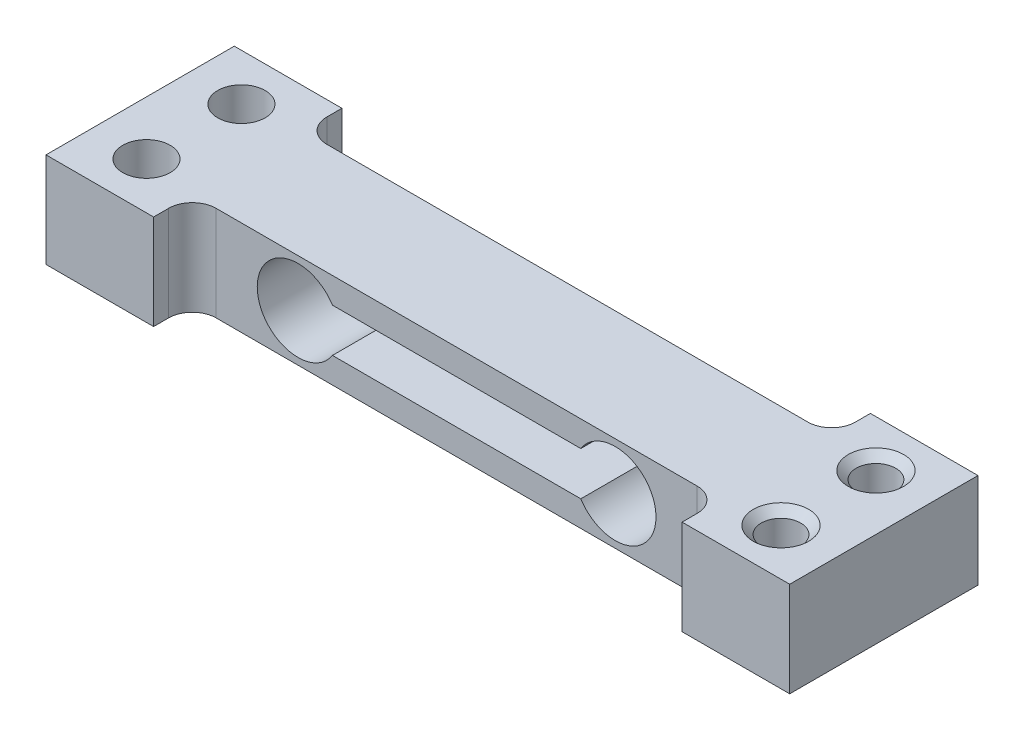
ISO-10303-21;
HEADER;
FILE_DESCRIPTION(('STEP AP214'),'2;1');
FILE_NAME('part.step','',(''),(''),'','','');
FILE_SCHEMA(('AUTOMOTIVE_DESIGN { 1 0 10303 214 1 1 1 1 }'));
ENDSEC;
DATA;
#1=APPLICATION_CONTEXT('core data for automotive mechanical design processes');
#2=APPLICATION_PROTOCOL_DEFINITION('international standard','automotive_design',2000,#1);
#3=PRODUCT_CONTEXT('',#1,'mechanical');
#4=PRODUCT('Part','Part','',(#3));
#5=PRODUCT_RELATED_PRODUCT_CATEGORY('part','',(#4));
#6=PRODUCT_DEFINITION_FORMATION('','',#4);
#7=PRODUCT_DEFINITION_CONTEXT('part definition',#1,'design');
#8=PRODUCT_DEFINITION('design','',#6,#7);
#9=PRODUCT_DEFINITION_SHAPE('','',#8);
#10=(LENGTH_UNIT() NAMED_UNIT(*) SI_UNIT(.MILLI.,.METRE.));
#11=(NAMED_UNIT(*) PLANE_ANGLE_UNIT() SI_UNIT($,.RADIAN.));
#12=(NAMED_UNIT(*) SI_UNIT($,.STERADIAN.) SOLID_ANGLE_UNIT());
#13=UNCERTAINTY_MEASURE_WITH_UNIT(LENGTH_MEASURE(1.E-05),#10,'distance_accuracy_value','');
#14=(GEOMETRIC_REPRESENTATION_CONTEXT(3) GLOBAL_UNCERTAINTY_ASSIGNED_CONTEXT((#13)) GLOBAL_UNIT_ASSIGNED_CONTEXT((#10,
#11,#12)) REPRESENTATION_CONTEXT('',''));
#15=CARTESIAN_POINT('',(0.,0.,0.));
#16=DIRECTION('',(0.,0.,1.));
#17=DIRECTION('',(1.,0.,0.));
#18=AXIS2_PLACEMENT_3D('',#15,#16,#17);
#19=CARTESIAN_POINT('',(0.,3.,-3.5));
#20=DIRECTION('',(0.,0.,1.));
#21=DIRECTION('',(1.,0.,0.));
#22=AXIS2_PLACEMENT_3D('',#19,#20,#21);
#23=PLANE('',#22);
#24=DIRECTION('',(1.,0.,0.));
#25=VECTOR('',#24,1.);
#26=CARTESIAN_POINT('',(0.,1.375,-3.5));
#27=LINE('',#26,#25);
#28=CARTESIAN_POINT('',(-7.84784589429227,1.375,-3.5));
#29=VERTEX_POINT('',#28);
#30=CARTESIAN_POINT('',(7.84784589429227,1.375,-3.5));
#31=VERTEX_POINT('',#30);
#32=EDGE_CURVE('E206',#29,#31,#27,.T.);
#33=ORIENTED_EDGE('',*,*,#32,.F.);
#34=CARTESIAN_POINT('',(-10.025,0.,-3.5));
#35=DIRECTION('',(0.,0.,-1.));
#36=DIRECTION('',(-1.,0.,0.));
#37=AXIS2_PLACEMENT_3D('',#34,#35,#36);
#38=CIRCLE('',#37,2.575);
#39=CARTESIAN_POINT('',(-7.84784589429227,-1.375,-3.5));
#40=VERTEX_POINT('',#39);
#41=EDGE_CURVE('E267',#40,#29,#38,.T.);
#42=ORIENTED_EDGE('',*,*,#41,.F.);
#43=DIRECTION('',(1.,0.,0.));
#44=VECTOR('',#43,1.);
#45=CARTESIAN_POINT('',(0.,-1.375,-3.5));
#46=LINE('',#45,#44);
#47=CARTESIAN_POINT('',(7.84784589429227,-1.375,-3.5));
#48=VERTEX_POINT('',#47);
#49=EDGE_CURVE('E203',#40,#48,#46,.T.);
#50=ORIENTED_EDGE('',*,*,#49,.T.);
#51=CARTESIAN_POINT('',(10.025,0.,-3.5));
#52=DIRECTION('',(0.,0.,1.));
#53=DIRECTION('',(1.,0.,0.));
#54=AXIS2_PLACEMENT_3D('',#51,#52,#53);
#55=CIRCLE('',#54,2.575);
#56=EDGE_CURVE('E147',#48,#31,#55,.T.);
#57=ORIENTED_EDGE('',*,*,#56,.T.);
#58=EDGE_LOOP('',(#33,#42,#50,#57));
#59=FACE_BOUND('',#58,.T.);
#60=DIRECTION('',(-1.,0.,0.));
#61=VECTOR('',#60,1.);
#62=CARTESIAN_POINT('',(0.,-3.,-3.5));
#63=LINE('',#62,#61);
#64=CARTESIAN_POINT('',(15.2,-3.,-3.5));
#65=VERTEX_POINT('',#64);
#66=CARTESIAN_POINT('',(-15.2,-3.,-3.5));
#67=VERTEX_POINT('',#66);
#68=EDGE_CURVE('E143',#65,#67,#63,.T.);
#69=ORIENTED_EDGE('',*,*,#68,.T.);
#70=DIRECTION('',(0.,-1.,0.));
#71=VECTOR('',#70,1.);
#72=CARTESIAN_POINT('',(-15.2,3.,-3.5));
#73=LINE('',#72,#71);
#74=CARTESIAN_POINT('',(-15.2,3.,-3.5));
#75=VERTEX_POINT('',#74);
#76=EDGE_CURVE('E241',#75,#67,#73,.T.);
#77=ORIENTED_EDGE('',*,*,#76,.F.);
#78=DIRECTION('',(-1.,0.,0.));
#79=VECTOR('',#78,1.);
#80=CARTESIAN_POINT('',(0.,3.,-3.5));
#81=LINE('',#80,#79);
#82=CARTESIAN_POINT('',(15.2,3.,-3.5));
#83=VERTEX_POINT('',#82);
#84=EDGE_CURVE('E161',#83,#75,#81,.T.);
#85=ORIENTED_EDGE('',*,*,#84,.F.);
#86=DIRECTION('',(0.,-1.,0.));
#87=VECTOR('',#86,1.);
#88=CARTESIAN_POINT('',(15.2,3.,-3.5));
#89=LINE('',#88,#87);
#90=EDGE_CURVE('E139',#83,#65,#89,.T.);
#91=ORIENTED_EDGE('',*,*,#90,.T.);
#92=EDGE_LOOP('',(#69,#77,#85,#91));
#93=FACE_BOUND('',#92,.T.);
#94=ADVANCED_FACE('F35',(#59,#93),#23,.F.);
#95=CARTESIAN_POINT('',(15.2,3.,3.49999999999999));
#96=DIRECTION('',(0.,0.,-1.));
#97=DIRECTION('',(-1.,0.,0.));
#98=AXIS2_PLACEMENT_3D('',#95,#96,#97);
#99=PLANE('',#98);
#100=CARTESIAN_POINT('',(-10.025,0.,3.5));
#101=DIRECTION('',(0.,0.,-1.));
#102=DIRECTION('',(-1.,0.,0.));
#103=AXIS2_PLACEMENT_3D('',#100,#101,#102);
#104=CIRCLE('',#103,2.575);
#105=CARTESIAN_POINT('',(-7.84784589429227,-1.375,3.5));
#106=VERTEX_POINT('',#105);
#107=CARTESIAN_POINT('',(-7.84784589429227,1.375,3.5));
#108=VERTEX_POINT('',#107);
#109=EDGE_CURVE('E293',#106,#108,#104,.T.);
#110=ORIENTED_EDGE('',*,*,#109,.T.);
#111=DIRECTION('',(1.,0.,0.));
#112=VECTOR('',#111,1.);
#113=CARTESIAN_POINT('',(0.,1.375,3.5));
#114=LINE('',#113,#112);
#115=CARTESIAN_POINT('',(7.84784589429227,1.375,3.5));
#116=VERTEX_POINT('',#115);
#117=EDGE_CURVE('E216',#108,#116,#114,.T.);
#118=ORIENTED_EDGE('',*,*,#117,.T.);
#119=CARTESIAN_POINT('',(10.025,0.,3.5));
#120=DIRECTION('',(0.,0.,1.));
#121=DIRECTION('',(1.,0.,0.));
#122=AXIS2_PLACEMENT_3D('',#119,#120,#121);
#123=CIRCLE('',#122,2.575);
#124=CARTESIAN_POINT('',(7.84784589429227,-1.375,3.5));
#125=VERTEX_POINT('',#124);
#126=EDGE_CURVE('E49',#125,#116,#123,.T.);
#127=ORIENTED_EDGE('',*,*,#126,.F.);
#128=DIRECTION('',(1.,0.,0.));
#129=VECTOR('',#128,1.);
#130=CARTESIAN_POINT('',(0.,-1.375,3.5));
#131=LINE('',#130,#129);
#132=EDGE_CURVE('E212',#106,#125,#131,.T.);
#133=ORIENTED_EDGE('',*,*,#132,.F.);
#134=EDGE_LOOP('',(#110,#118,#127,#133));
#135=FACE_BOUND('',#134,.T.);
#136=DIRECTION('',(1.,0.,0.));
#137=VECTOR('',#136,1.);
#138=CARTESIAN_POINT('',(15.2,3.,3.49999999999999));
#139=LINE('',#138,#137);
#140=CARTESIAN_POINT('',(-15.2,3.,3.49999999999999));
#141=VERTEX_POINT('',#140);
#142=CARTESIAN_POINT('',(15.2,3.,3.49999999999999));
#143=VERTEX_POINT('',#142);
#144=EDGE_CURVE('E99',#141,#143,#139,.T.);
#145=ORIENTED_EDGE('',*,*,#144,.F.);
#146=DIRECTION('',(0.,-1.,0.));
#147=VECTOR('',#146,1.);
#148=CARTESIAN_POINT('',(-15.2,3.,3.49999999999999));
#149=LINE('',#148,#147);
#150=CARTESIAN_POINT('',(-15.2,-3.,3.49999999999999));
#151=VERTEX_POINT('',#150);
#152=EDGE_CURVE('E220',#141,#151,#149,.T.);
#153=ORIENTED_EDGE('',*,*,#152,.T.);
#154=DIRECTION('',(1.,0.,0.));
#155=VECTOR('',#154,1.);
#156=CARTESIAN_POINT('',(15.2,-3.,3.49999999999999));
#157=LINE('',#156,#155);
#158=CARTESIAN_POINT('',(15.2,-3.,3.49999999999999));
#159=VERTEX_POINT('',#158);
#160=EDGE_CURVE('E146',#151,#159,#157,.T.);
#161=ORIENTED_EDGE('',*,*,#160,.T.);
#162=DIRECTION('',(0.,-1.,0.));
#163=VECTOR('',#162,1.);
#164=CARTESIAN_POINT('',(15.2,3.,3.49999999999999));
#165=LINE('',#164,#163);
#166=EDGE_CURVE('E11',#143,#159,#165,.T.);
#167=ORIENTED_EDGE('',*,*,#166,.F.);
#168=EDGE_LOOP('',(#145,#153,#161,#167));
#169=FACE_BOUND('',#168,.T.);
#170=ADVANCED_FACE('F372',(#135,#169),#99,.F.);
#171=CARTESIAN_POINT('',(15.2,3.,4.99999999999999));
#172=DIRECTION('',(0.,-1.,0.));
#173=DIRECTION('',(0.,0.,-1.));
#174=AXIS2_PLACEMENT_3D('',#171,#172,#173);
#175=CYLINDRICAL_SURFACE('',#174,1.5);
#176=CARTESIAN_POINT('',(15.2,-3.,4.99999999999999));
#177=DIRECTION('',(0.,-1.,0.));
#178=DIRECTION('',(0.,0.,1.));
#179=AXIS2_PLACEMENT_3D('',#176,#177,#178);
#180=CIRCLE('',#179,1.5);
#181=CARTESIAN_POINT('',(16.7,-3.,4.99999999999999));
#182=VERTEX_POINT('',#181);
#183=EDGE_CURVE('E149',#159,#182,#180,.T.);
#184=ORIENTED_EDGE('',*,*,#183,.T.);
#185=DIRECTION('',(0.,-1.,0.));
#186=VECTOR('',#185,1.);
#187=CARTESIAN_POINT('',(16.7,3.,4.99999999999999));
#188=LINE('',#187,#186);
#189=CARTESIAN_POINT('',(16.7,3.,4.99999999999999));
#190=VERTEX_POINT('',#189);
#191=EDGE_CURVE('E42',#190,#182,#188,.T.);
#192=ORIENTED_EDGE('',*,*,#191,.F.);
#193=CARTESIAN_POINT('',(15.2,3.,4.99999999999999));
#194=DIRECTION('',(0.,-1.,0.));
#195=DIRECTION('',(0.,0.,1.));
#196=AXIS2_PLACEMENT_3D('',#193,#194,#195);
#197=CIRCLE('',#196,1.5);
#198=EDGE_CURVE('E197',#143,#190,#197,.T.);
#199=ORIENTED_EDGE('',*,*,#198,.F.);
#200=ORIENTED_EDGE('',*,*,#166,.T.);
#201=EDGE_LOOP('',(#184,#192,#199,#200));
#202=FACE_BOUND('',#201,.T.);
#203=ADVANCED_FACE('F377',(#202),#175,.F.);
#204=CARTESIAN_POINT('',(16.7,3.,4.99999999999999));
#205=DIRECTION('',(1.,0.,0.));
#206=DIRECTION('',(0.,0.,-1.));
#207=AXIS2_PLACEMENT_3D('',#204,#205,#206);
#208=PLANE('',#207);
#209=DIRECTION('',(0.,0.,1.));
#210=VECTOR('',#209,1.);
#211=CARTESIAN_POINT('',(16.7,-3.,4.99999999999999));
#212=LINE('',#211,#210);
#213=CARTESIAN_POINT('',(16.7,-3.,5.95));
#214=VERTEX_POINT('',#213);
#215=EDGE_CURVE('E151',#182,#214,#212,.T.);
#216=ORIENTED_EDGE('',*,*,#215,.T.);
#217=DIRECTION('',(0.,-1.,0.));
#218=VECTOR('',#217,1.);
#219=CARTESIAN_POINT('',(16.7,3.,5.95));
#220=LINE('',#219,#218);
#221=CARTESIAN_POINT('',(16.7,3.,5.95));
#222=VERTEX_POINT('',#221);
#223=EDGE_CURVE('E168',#222,#214,#220,.T.);
#224=ORIENTED_EDGE('',*,*,#223,.F.);
#225=DIRECTION('',(0.,0.,1.));
#226=VECTOR('',#225,1.);
#227=CARTESIAN_POINT('',(16.7,3.,4.99999999999999));
#228=LINE('',#227,#226);
#229=EDGE_CURVE('E177',#190,#222,#228,.T.);
#230=ORIENTED_EDGE('',*,*,#229,.F.);
#231=ORIENTED_EDGE('',*,*,#191,.T.);
#232=EDGE_LOOP('',(#216,#224,#230,#231));
#233=FACE_BOUND('',#232,.T.);
#234=ADVANCED_FACE('F175',(#233),#208,.F.);
#235=CARTESIAN_POINT('',(23.5,3.,5.95));
#236=DIRECTION('',(0.,0.,-1.));
#237=DIRECTION('',(-1.,0.,0.));
#238=AXIS2_PLACEMENT_3D('',#235,#236,#237);
#239=PLANE('',#238);
#240=DIRECTION('',(1.,0.,0.));
#241=VECTOR('',#240,1.);
#242=CARTESIAN_POINT('',(23.5,-3.,5.95));
#243=LINE('',#242,#241);
#244=CARTESIAN_POINT('',(23.5,-3.,5.95));
#245=VERTEX_POINT('',#244);
#246=EDGE_CURVE('E153',#214,#245,#243,.T.);
#247=ORIENTED_EDGE('',*,*,#246,.T.);
#248=DIRECTION('',(0.,-1.,0.));
#249=VECTOR('',#248,1.);
#250=CARTESIAN_POINT('',(23.5,3.,5.95));
#251=LINE('',#250,#249);
#252=CARTESIAN_POINT('',(23.5,3.,5.95));
#253=VERTEX_POINT('',#252);
#254=EDGE_CURVE('E165',#253,#245,#251,.T.);
#255=ORIENTED_EDGE('',*,*,#254,.F.);
#256=DIRECTION('',(1.,0.,0.));
#257=VECTOR('',#256,1.);
#258=CARTESIAN_POINT('',(23.5,3.,5.95));
#259=LINE('',#258,#257);
#260=EDGE_CURVE('E193',#222,#253,#259,.T.);
#261=ORIENTED_EDGE('',*,*,#260,.F.);
#262=ORIENTED_EDGE('',*,*,#223,.T.);
#263=EDGE_LOOP('',(#247,#255,#261,#262));
#264=FACE_BOUND('',#263,.T.);
#265=ADVANCED_FACE('F189',(#264),#239,.F.);
#266=CARTESIAN_POINT('',(23.5,3.,-5.95));
#267=DIRECTION('',(-1.,0.,0.));
#268=DIRECTION('',(0.,0.,1.));
#269=AXIS2_PLACEMENT_3D('',#266,#267,#268);
#270=PLANE('',#269);
#271=DIRECTION('',(0.,0.,-1.));
#272=VECTOR('',#271,1.);
#273=CARTESIAN_POINT('',(23.5,-3.,-5.95));
#274=LINE('',#273,#272);
#275=CARTESIAN_POINT('',(23.5,-3.,-5.95));
#276=VERTEX_POINT('',#275);
#277=EDGE_CURVE('E155',#245,#276,#274,.T.);
#278=ORIENTED_EDGE('',*,*,#277,.T.);
#279=DIRECTION('',(0.,-1.,0.));
#280=VECTOR('',#279,1.);
#281=CARTESIAN_POINT('',(23.5,3.,-5.95));
#282=LINE('',#281,#280);
#283=CARTESIAN_POINT('',(23.5,3.,-5.95));
#284=VERTEX_POINT('',#283);
#285=EDGE_CURVE('E134',#284,#276,#282,.T.);
#286=ORIENTED_EDGE('',*,*,#285,.F.);
#287=DIRECTION('',(0.,0.,-1.));
#288=VECTOR('',#287,1.);
#289=CARTESIAN_POINT('',(23.5,3.,-5.95));
#290=LINE('',#289,#288);
#291=EDGE_CURVE('E122',#253,#284,#290,.T.);
#292=ORIENTED_EDGE('',*,*,#291,.F.);
#293=ORIENTED_EDGE('',*,*,#254,.T.);
#294=EDGE_LOOP('',(#278,#286,#292,#293));
#295=FACE_BOUND('',#294,.T.);
#296=ADVANCED_FACE('F192',(#295),#270,.F.);
#297=CARTESIAN_POINT('',(16.7,3.,-5.95));
#298=DIRECTION('',(0.,0.,1.));
#299=DIRECTION('',(1.,0.,0.));
#300=AXIS2_PLACEMENT_3D('',#297,#298,#299);
#301=PLANE('',#300);
#302=DIRECTION('',(-1.,0.,0.));
#303=VECTOR('',#302,1.);
#304=CARTESIAN_POINT('',(16.7,-3.,-5.95));
#305=LINE('',#304,#303);
#306=CARTESIAN_POINT('',(16.7,-3.,-5.95));
#307=VERTEX_POINT('',#306);
#308=EDGE_CURVE('E131',#276,#307,#305,.T.);
#309=ORIENTED_EDGE('',*,*,#308,.T.);
#310=DIRECTION('',(0.,-1.,0.));
#311=VECTOR('',#310,1.);
#312=CARTESIAN_POINT('',(16.7,3.,-5.95));
#313=LINE('',#312,#311);
#314=CARTESIAN_POINT('',(16.7,3.,-5.95));
#315=VERTEX_POINT('',#314);
#316=EDGE_CURVE('E128',#315,#307,#313,.T.);
#317=ORIENTED_EDGE('',*,*,#316,.F.);
#318=DIRECTION('',(-1.,0.,0.));
#319=VECTOR('',#318,1.);
#320=CARTESIAN_POINT('',(16.7,3.,-5.95));
#321=LINE('',#320,#319);
#322=EDGE_CURVE('E115',#284,#315,#321,.T.);
#323=ORIENTED_EDGE('',*,*,#322,.F.);
#324=ORIENTED_EDGE('',*,*,#285,.T.);
#325=EDGE_LOOP('',(#309,#317,#323,#324));
#326=FACE_BOUND('',#325,.T.);
#327=ADVANCED_FACE('F129',(#326),#301,.F.);
#328=CARTESIAN_POINT('',(16.7,3.,-5.));
#329=DIRECTION('',(1.,0.,0.));
#330=DIRECTION('',(0.,0.,-1.));
#331=AXIS2_PLACEMENT_3D('',#328,#329,#330);
#332=PLANE('',#331);
#333=DIRECTION('',(0.,0.,1.));
#334=VECTOR('',#333,1.);
#335=CARTESIAN_POINT('',(16.7,-3.,-5.));
#336=LINE('',#335,#334);
#337=CARTESIAN_POINT('',(16.7,-3.,-5.));
#338=VERTEX_POINT('',#337);
#339=EDGE_CURVE('E158',#307,#338,#336,.T.);
#340=ORIENTED_EDGE('',*,*,#339,.T.);
#341=DIRECTION('',(0.,-1.,0.));
#342=VECTOR('',#341,1.);
#343=CARTESIAN_POINT('',(16.7,3.,-5.));
#344=LINE('',#343,#342);
#345=CARTESIAN_POINT('',(16.7,3.,-5.));
#346=VERTEX_POINT('',#345);
#347=EDGE_CURVE('E135',#346,#338,#344,.T.);
#348=ORIENTED_EDGE('',*,*,#347,.F.);
#349=DIRECTION('',(0.,0.,1.));
#350=VECTOR('',#349,1.);
#351=CARTESIAN_POINT('',(16.7,3.,-5.));
#352=LINE('',#351,#350);
#353=EDGE_CURVE('E119',#315,#346,#352,.T.);
#354=ORIENTED_EDGE('',*,*,#353,.F.);
#355=ORIENTED_EDGE('',*,*,#316,.T.);
#356=EDGE_LOOP('',(#340,#348,#354,#355));
#357=FACE_BOUND('',#356,.T.);
#358=ADVANCED_FACE('F137',(#357),#332,.F.);
#359=CARTESIAN_POINT('',(15.2,3.,-5.));
#360=DIRECTION('',(0.,-1.,0.));
#361=DIRECTION('',(0.,0.,-1.));
#362=AXIS2_PLACEMENT_3D('',#359,#360,#361);
#363=CYLINDRICAL_SURFACE('',#362,1.5);
#364=CARTESIAN_POINT('',(15.2,-3.,-5.));
#365=DIRECTION('',(0.,-1.,0.));
#366=DIRECTION('',(0.,0.,1.));
#367=AXIS2_PLACEMENT_3D('',#364,#365,#366);
#368=CIRCLE('',#367,1.5);
#369=EDGE_CURVE('E91',#338,#65,#368,.T.);
#370=ORIENTED_EDGE('',*,*,#369,.T.);
#371=ORIENTED_EDGE('',*,*,#90,.F.);
#372=CARTESIAN_POINT('',(15.2,3.,-5.));
#373=DIRECTION('',(0.,-1.,0.));
#374=DIRECTION('',(0.,0.,1.));
#375=AXIS2_PLACEMENT_3D('',#372,#373,#374);
#376=CIRCLE('',#375,1.5);
#377=EDGE_CURVE('E58',#346,#83,#376,.T.);
#378=ORIENTED_EDGE('',*,*,#377,.F.);
#379=ORIENTED_EDGE('',*,*,#347,.T.);
#380=EDGE_LOOP('',(#370,#371,#378,#379));
#381=FACE_BOUND('',#380,.T.);
#382=ADVANCED_FACE('F346',(#381),#363,.F.);
#383=CARTESIAN_POINT('',(15.2,3.,-5.));
#384=DIRECTION('',(0.,1.,0.));
#385=DIRECTION('',(0.,0.,1.));
#386=AXIS2_PLACEMENT_3D('',#383,#384,#385);
#387=PLANE('',#386);
#388=CARTESIAN_POINT('',(-20.1,3.,3.));
#389=DIRECTION('',(0.,1.,0.));
#390=DIRECTION('',(0.,0.,1.));
#391=AXIS2_PLACEMENT_3D('',#388,#389,#390);
#392=CIRCLE('',#391,1.5);
#393=CARTESIAN_POINT('',(-20.1,3.,4.5));
#394=VERTEX_POINT('',#393);
#395=EDGE_CURVE('E329',#394,#394,#392,.T.);
#396=ORIENTED_EDGE('',*,*,#395,.F.);
#397=EDGE_LOOP('',(#396));
#398=FACE_BOUND('',#397,.T.);
#399=CARTESIAN_POINT('',(-20.1,3.,-3.));
#400=DIRECTION('',(0.,1.,0.));
#401=DIRECTION('',(0.,0.,1.));
#402=AXIS2_PLACEMENT_3D('',#399,#400,#401);
#403=CIRCLE('',#402,1.5);
#404=CARTESIAN_POINT('',(-20.1,3.,-1.5));
#405=VERTEX_POINT('',#404);
#406=EDGE_CURVE('E323',#405,#405,#403,.T.);
#407=ORIENTED_EDGE('',*,*,#406,.F.);
#408=EDGE_LOOP('',(#407));
#409=FACE_BOUND('',#408,.T.);
#410=CARTESIAN_POINT('',(20.,3.,-3.));
#411=DIRECTION('',(0.,1.,0.));
#412=DIRECTION('',(0.,0.,1.));
#413=AXIS2_PLACEMENT_3D('',#410,#411,#412);
#414=CIRCLE('',#413,1.75);
#415=CARTESIAN_POINT('',(20.,3.,-1.25));
#416=VERTEX_POINT('',#415);
#417=EDGE_CURVE('E316',#416,#416,#414,.T.);
#418=ORIENTED_EDGE('',*,*,#417,.F.);
#419=EDGE_LOOP('',(#418));
#420=FACE_BOUND('',#419,.T.);
#421=CARTESIAN_POINT('',(20.,3.,3.));
#422=DIRECTION('',(0.,1.,0.));
#423=DIRECTION('',(0.,0.,1.));
#424=AXIS2_PLACEMENT_3D('',#421,#422,#423);
#425=CIRCLE('',#424,1.75);
#426=CARTESIAN_POINT('',(20.,3.,4.75));
#427=VERTEX_POINT('',#426);
#428=EDGE_CURVE('E304',#427,#427,#425,.T.);
#429=ORIENTED_EDGE('',*,*,#428,.F.);
#430=EDGE_LOOP('',(#429));
#431=FACE_BOUND('',#430,.T.);
#432=ORIENTED_EDGE('',*,*,#84,.T.);
#433=CARTESIAN_POINT('',(-15.2,3.,-5.));
#434=DIRECTION('',(0.,1.,0.));
#435=DIRECTION('',(0.,0.,1.));
#436=AXIS2_PLACEMENT_3D('',#433,#434,#435);
#437=CIRCLE('',#436,1.5);
#438=CARTESIAN_POINT('',(-16.7,3.,-5.));
#439=VERTEX_POINT('',#438);
#440=EDGE_CURVE('E244',#439,#75,#437,.T.);
#441=ORIENTED_EDGE('',*,*,#440,.F.);
#442=DIRECTION('',(0.,0.,1.));
#443=VECTOR('',#442,1.);
#444=CARTESIAN_POINT('',(-16.7,3.,-5.));
#445=LINE('',#444,#443);
#446=CARTESIAN_POINT('',(-16.7,3.,-5.95));
#447=VERTEX_POINT('',#446);
#448=EDGE_CURVE('E270',#447,#439,#445,.T.);
#449=ORIENTED_EDGE('',*,*,#448,.F.);
#450=DIRECTION('',(1.,0.,0.));
#451=VECTOR('',#450,1.);
#452=CARTESIAN_POINT('',(-16.7,3.,-5.95));
#453=LINE('',#452,#451);
#454=CARTESIAN_POINT('',(-23.5,3.,-5.95));
#455=VERTEX_POINT('',#454);
#456=EDGE_CURVE('E273',#455,#447,#453,.T.);
#457=ORIENTED_EDGE('',*,*,#456,.F.);
#458=DIRECTION('',(0.,0.,-1.));
#459=VECTOR('',#458,1.);
#460=CARTESIAN_POINT('',(-23.5,3.,-5.95));
#461=LINE('',#460,#459);
#462=CARTESIAN_POINT('',(-23.5,3.,5.95));
#463=VERTEX_POINT('',#462);
#464=EDGE_CURVE('E276',#463,#455,#461,.T.);
#465=ORIENTED_EDGE('',*,*,#464,.F.);
#466=DIRECTION('',(-1.,0.,0.));
#467=VECTOR('',#466,1.);
#468=CARTESIAN_POINT('',(-23.5,3.,5.95));
#469=LINE('',#468,#467);
#470=CARTESIAN_POINT('',(-16.7,3.,5.95));
#471=VERTEX_POINT('',#470);
#472=EDGE_CURVE('E279',#471,#463,#469,.T.);
#473=ORIENTED_EDGE('',*,*,#472,.F.);
#474=DIRECTION('',(0.,0.,1.));
#475=VECTOR('',#474,1.);
#476=CARTESIAN_POINT('',(-16.7,3.,4.99999999999999));
#477=LINE('',#476,#475);
#478=CARTESIAN_POINT('',(-16.7,3.,4.99999999999999));
#479=VERTEX_POINT('',#478);
#480=EDGE_CURVE('E282',#479,#471,#477,.T.);
#481=ORIENTED_EDGE('',*,*,#480,.F.);
#482=CARTESIAN_POINT('',(-15.2,3.,4.99999999999999));
#483=DIRECTION('',(0.,1.,0.));
#484=DIRECTION('',(0.,0.,1.));
#485=AXIS2_PLACEMENT_3D('',#482,#483,#484);
#486=CIRCLE('',#485,1.5);
#487=EDGE_CURVE('E248',#141,#479,#486,.T.);
#488=ORIENTED_EDGE('',*,*,#487,.F.);
#489=ORIENTED_EDGE('',*,*,#144,.T.);
#490=ORIENTED_EDGE('',*,*,#198,.T.);
#491=ORIENTED_EDGE('',*,*,#229,.T.);
#492=ORIENTED_EDGE('',*,*,#260,.T.);
#493=ORIENTED_EDGE('',*,*,#291,.T.);
#494=ORIENTED_EDGE('',*,*,#322,.T.);
#495=ORIENTED_EDGE('',*,*,#353,.T.);
#496=ORIENTED_EDGE('',*,*,#377,.T.);
#497=EDGE_LOOP('',(#432,#441,#449,#457,#465,#473,#481,#488,#489,#490,#491,#492,#493,#494,#495,#496));
#498=FACE_BOUND('',#497,.T.);
#499=ADVANCED_FACE('F117',(#398,#409,#420,#431,#498),#387,.T.);
#500=CARTESIAN_POINT('',(15.2,-3.,-5.));
#501=DIRECTION('',(0.,1.,0.));
#502=DIRECTION('',(0.,0.,1.));
#503=AXIS2_PLACEMENT_3D('',#500,#501,#502);
#504=PLANE('',#503);
#505=CARTESIAN_POINT('',(-20.1,-3.,3.));
#506=DIRECTION('',(0.,1.,0.));
#507=DIRECTION('',(0.,0.,1.));
#508=AXIS2_PLACEMENT_3D('',#505,#506,#507);
#509=CIRCLE('',#508,1.5);
#510=CARTESIAN_POINT('',(-20.1,-3.,4.5));
#511=VERTEX_POINT('',#510);
#512=EDGE_CURVE('E322',#511,#511,#509,.T.);
#513=ORIENTED_EDGE('',*,*,#512,.T.);
#514=EDGE_LOOP('',(#513));
#515=FACE_BOUND('',#514,.T.);
#516=CARTESIAN_POINT('',(-20.1,-3.,-3.));
#517=DIRECTION('',(0.,1.,0.));
#518=DIRECTION('',(0.,0.,1.));
#519=AXIS2_PLACEMENT_3D('',#516,#517,#518);
#520=CIRCLE('',#519,1.5);
#521=CARTESIAN_POINT('',(-20.1,-3.,-1.5));
#522=VERTEX_POINT('',#521);
#523=EDGE_CURVE('E326',#522,#522,#520,.T.);
#524=ORIENTED_EDGE('',*,*,#523,.T.);
#525=EDGE_LOOP('',(#524));
#526=FACE_BOUND('',#525,.T.);
#527=CARTESIAN_POINT('',(20.,-3.,-3.));
#528=DIRECTION('',(0.,1.,0.));
#529=DIRECTION('',(0.,0.,1.));
#530=AXIS2_PLACEMENT_3D('',#527,#528,#529);
#531=CIRCLE('',#530,1.75);
#532=CARTESIAN_POINT('',(20.,-3.,-1.25));
#533=VERTEX_POINT('',#532);
#534=EDGE_CURVE('E319',#533,#533,#531,.T.);
#535=ORIENTED_EDGE('',*,*,#534,.T.);
#536=EDGE_LOOP('',(#535));
#537=FACE_BOUND('',#536,.T.);
#538=CARTESIAN_POINT('',(20.,-3.,3.));
#539=DIRECTION('',(0.,1.,0.));
#540=DIRECTION('',(0.,0.,1.));
#541=AXIS2_PLACEMENT_3D('',#538,#539,#540);
#542=CIRCLE('',#541,1.75);
#543=CARTESIAN_POINT('',(20.,-3.,4.75));
#544=VERTEX_POINT('',#543);
#545=EDGE_CURVE('E307',#544,#544,#542,.T.);
#546=ORIENTED_EDGE('',*,*,#545,.T.);
#547=EDGE_LOOP('',(#546));
#548=FACE_BOUND('',#547,.T.);
#549=ORIENTED_EDGE('',*,*,#68,.F.);
#550=ORIENTED_EDGE('',*,*,#369,.F.);
#551=ORIENTED_EDGE('',*,*,#339,.F.);
#552=ORIENTED_EDGE('',*,*,#308,.F.);
#553=ORIENTED_EDGE('',*,*,#277,.F.);
#554=ORIENTED_EDGE('',*,*,#246,.F.);
#555=ORIENTED_EDGE('',*,*,#215,.F.);
#556=ORIENTED_EDGE('',*,*,#183,.F.);
#557=ORIENTED_EDGE('',*,*,#160,.F.);
#558=CARTESIAN_POINT('',(-15.2,-3.,4.99999999999999));
#559=DIRECTION('',(0.,1.,0.));
#560=DIRECTION('',(0.,0.,1.));
#561=AXIS2_PLACEMENT_3D('',#558,#559,#560);
#562=CIRCLE('',#561,1.5);
#563=CARTESIAN_POINT('',(-16.7,-3.,4.99999999999999));
#564=VERTEX_POINT('',#563);
#565=EDGE_CURVE('E264',#151,#564,#562,.T.);
#566=ORIENTED_EDGE('',*,*,#565,.T.);
#567=DIRECTION('',(0.,0.,1.));
#568=VECTOR('',#567,1.);
#569=CARTESIAN_POINT('',(-16.7,-3.,4.99999999999999));
#570=LINE('',#569,#568);
#571=CARTESIAN_POINT('',(-16.7,-3.,5.95));
#572=VERTEX_POINT('',#571);
#573=EDGE_CURVE('E261',#564,#572,#570,.T.);
#574=ORIENTED_EDGE('',*,*,#573,.T.);
#575=DIRECTION('',(-1.,0.,0.));
#576=VECTOR('',#575,1.);
#577=CARTESIAN_POINT('',(-23.5,-3.,5.95));
#578=LINE('',#577,#576);
#579=CARTESIAN_POINT('',(-23.5,-3.,5.95));
#580=VERTEX_POINT('',#579);
#581=EDGE_CURVE('E258',#572,#580,#578,.T.);
#582=ORIENTED_EDGE('',*,*,#581,.T.);
#583=DIRECTION('',(0.,0.,-1.));
#584=VECTOR('',#583,1.);
#585=CARTESIAN_POINT('',(-23.5,-3.,-5.95));
#586=LINE('',#585,#584);
#587=CARTESIAN_POINT('',(-23.5,-3.,-5.95));
#588=VERTEX_POINT('',#587);
#589=EDGE_CURVE('E255',#580,#588,#586,.T.);
#590=ORIENTED_EDGE('',*,*,#589,.T.);
#591=DIRECTION('',(1.,0.,0.));
#592=VECTOR('',#591,1.);
#593=CARTESIAN_POINT('',(-16.7,-3.,-5.95));
#594=LINE('',#593,#592);
#595=CARTESIAN_POINT('',(-16.7,-3.,-5.95));
#596=VERTEX_POINT('',#595);
#597=EDGE_CURVE('E252',#588,#596,#594,.T.);
#598=ORIENTED_EDGE('',*,*,#597,.T.);
#599=DIRECTION('',(0.,0.,1.));
#600=VECTOR('',#599,1.);
#601=CARTESIAN_POINT('',(-16.7,-3.,-5.));
#602=LINE('',#601,#600);
#603=CARTESIAN_POINT('',(-16.7,-3.,-5.));
#604=VERTEX_POINT('',#603);
#605=EDGE_CURVE('E249',#596,#604,#602,.T.);
#606=ORIENTED_EDGE('',*,*,#605,.T.);
#607=CARTESIAN_POINT('',(-15.2,-3.,-5.));
#608=DIRECTION('',(0.,1.,0.));
#609=DIRECTION('',(0.,0.,1.));
#610=AXIS2_PLACEMENT_3D('',#607,#608,#609);
#611=CIRCLE('',#610,1.5);
#612=EDGE_CURVE('E245',#604,#67,#611,.T.);
#613=ORIENTED_EDGE('',*,*,#612,.T.);
#614=EDGE_LOOP('',(#549,#550,#551,#552,#553,#554,#555,#556,#557,#566,#574,#582,#590,#598,#606,#613));
#615=FACE_BOUND('',#614,.T.);
#616=ADVANCED_FACE('F184',(#515,#526,#537,#548,#615),#504,.F.);
#617=CARTESIAN_POINT('',(10.025,0.,-5.95));
#618=DIRECTION('',(0.,0.,1.));
#619=DIRECTION('',(1.,0.,0.));
#620=AXIS2_PLACEMENT_3D('',#617,#618,#619);
#621=CYLINDRICAL_SURFACE('',#620,2.575);
#622=DIRECTION('',(0.,0.,1.));
#623=VECTOR('',#622,1.);
#624=CARTESIAN_POINT('',(7.84784589429227,-1.375,-5.95));
#625=LINE('',#624,#623);
#626=EDGE_CURVE('E209',#48,#125,#625,.T.);
#627=ORIENTED_EDGE('',*,*,#626,.T.);
#628=ORIENTED_EDGE('',*,*,#126,.T.);
#629=DIRECTION('',(0.,0.,1.));
#630=VECTOR('',#629,1.);
#631=CARTESIAN_POINT('',(7.84784589429227,1.375,-5.95));
#632=LINE('',#631,#630);
#633=EDGE_CURVE('E210',#31,#116,#632,.T.);
#634=ORIENTED_EDGE('',*,*,#633,.F.);
#635=ORIENTED_EDGE('',*,*,#56,.F.);
#636=EDGE_LOOP('',(#627,#628,#634,#635));
#637=FACE_BOUND('',#636,.T.);
#638=ADVANCED_FACE('F434',(#637),#621,.F.);
#639=CARTESIAN_POINT('',(0.,-1.375,-5.95));
#640=DIRECTION('',(0.,-1.,0.));
#641=DIRECTION('',(0.,0.,-1.));
#642=AXIS2_PLACEMENT_3D('',#639,#640,#641);
#643=PLANE('',#642);
#644=ORIENTED_EDGE('',*,*,#49,.F.);
#645=DIRECTION('',(0.,0.,1.));
#646=VECTOR('',#645,1.);
#647=CARTESIAN_POINT('',(-7.84784589429227,-1.375,-5.95));
#648=LINE('',#647,#646);
#649=EDGE_CURVE('E289',#40,#106,#648,.T.);
#650=ORIENTED_EDGE('',*,*,#649,.T.);
#651=ORIENTED_EDGE('',*,*,#132,.T.);
#652=ORIENTED_EDGE('',*,*,#626,.F.);
#653=EDGE_LOOP('',(#644,#650,#651,#652));
#654=FACE_BOUND('',#653,.T.);
#655=ADVANCED_FACE('F437',(#654),#643,.F.);
#656=CARTESIAN_POINT('',(0.,1.375,-5.95));
#657=DIRECTION('',(0.,-1.,0.));
#658=DIRECTION('',(0.,0.,-1.));
#659=AXIS2_PLACEMENT_3D('',#656,#657,#658);
#660=PLANE('',#659);
#661=ORIENTED_EDGE('',*,*,#32,.T.);
#662=ORIENTED_EDGE('',*,*,#633,.T.);
#663=ORIENTED_EDGE('',*,*,#117,.F.);
#664=DIRECTION('',(0.,0.,1.));
#665=VECTOR('',#664,1.);
#666=CARTESIAN_POINT('',(-7.84784589429227,1.375,-5.95));
#667=LINE('',#666,#665);
#668=EDGE_CURVE('E290',#29,#108,#667,.T.);
#669=ORIENTED_EDGE('',*,*,#668,.F.);
#670=EDGE_LOOP('',(#661,#662,#663,#669));
#671=FACE_BOUND('',#670,.T.);
#672=ADVANCED_FACE('F495',(#671),#660,.T.);
#673=CARTESIAN_POINT('',(-15.2,3.,4.99999999999999));
#674=DIRECTION('',(0.,-1.,0.));
#675=DIRECTION('',(0.,0.,-1.));
#676=AXIS2_PLACEMENT_3D('',#673,#674,#675);
#677=CYLINDRICAL_SURFACE('',#676,1.5);
#678=ORIENTED_EDGE('',*,*,#565,.F.);
#679=ORIENTED_EDGE('',*,*,#152,.F.);
#680=ORIENTED_EDGE('',*,*,#487,.T.);
#681=DIRECTION('',(0.,-1.,0.));
#682=VECTOR('',#681,1.);
#683=CARTESIAN_POINT('',(-16.7,3.,4.99999999999999));
#684=LINE('',#683,#682);
#685=EDGE_CURVE('E223',#479,#564,#684,.T.);
#686=ORIENTED_EDGE('',*,*,#685,.T.);
#687=EDGE_LOOP('',(#678,#679,#680,#686));
#688=FACE_BOUND('',#687,.T.);
#689=ADVANCED_FACE('F472',(#688),#677,.F.);
#690=CARTESIAN_POINT('',(-16.7,3.,4.99999999999999));
#691=DIRECTION('',(-1.,0.,0.));
#692=DIRECTION('',(0.,0.,-1.));
#693=AXIS2_PLACEMENT_3D('',#690,#691,#692);
#694=PLANE('',#693);
#695=ORIENTED_EDGE('',*,*,#573,.F.);
#696=ORIENTED_EDGE('',*,*,#685,.F.);
#697=ORIENTED_EDGE('',*,*,#480,.T.);
#698=DIRECTION('',(0.,-1.,0.));
#699=VECTOR('',#698,1.);
#700=CARTESIAN_POINT('',(-16.7,3.,5.95));
#701=LINE('',#700,#699);
#702=EDGE_CURVE('E226',#471,#572,#701,.T.);
#703=ORIENTED_EDGE('',*,*,#702,.T.);
#704=EDGE_LOOP('',(#695,#696,#697,#703));
#705=FACE_BOUND('',#704,.T.);
#706=ADVANCED_FACE('F469',(#705),#694,.F.);
#707=CARTESIAN_POINT('',(-23.5,3.,5.95));
#708=DIRECTION('',(0.,0.,-1.));
#709=DIRECTION('',(1.,0.,0.));
#710=AXIS2_PLACEMENT_3D('',#707,#708,#709);
#711=PLANE('',#710);
#712=ORIENTED_EDGE('',*,*,#581,.F.);
#713=ORIENTED_EDGE('',*,*,#702,.F.);
#714=ORIENTED_EDGE('',*,*,#472,.T.);
#715=DIRECTION('',(0.,-1.,0.));
#716=VECTOR('',#715,1.);
#717=CARTESIAN_POINT('',(-23.5,3.,5.95));
#718=LINE('',#717,#716);
#719=EDGE_CURVE('E229',#463,#580,#718,.T.);
#720=ORIENTED_EDGE('',*,*,#719,.T.);
#721=EDGE_LOOP('',(#712,#713,#714,#720));
#722=FACE_BOUND('',#721,.T.);
#723=ADVANCED_FACE('F465',(#722),#711,.F.);
#724=CARTESIAN_POINT('',(-23.5,3.,-5.95));
#725=DIRECTION('',(1.,0.,0.));
#726=DIRECTION('',(0.,0.,1.));
#727=AXIS2_PLACEMENT_3D('',#724,#725,#726);
#728=PLANE('',#727);
#729=ORIENTED_EDGE('',*,*,#589,.F.);
#730=ORIENTED_EDGE('',*,*,#719,.F.);
#731=ORIENTED_EDGE('',*,*,#464,.T.);
#732=DIRECTION('',(0.,-1.,0.));
#733=VECTOR('',#732,1.);
#734=CARTESIAN_POINT('',(-23.5,3.,-5.95));
#735=LINE('',#734,#733);
#736=EDGE_CURVE('E232',#455,#588,#735,.T.);
#737=ORIENTED_EDGE('',*,*,#736,.T.);
#738=EDGE_LOOP('',(#729,#730,#731,#737));
#739=FACE_BOUND('',#738,.T.);
#740=ADVANCED_FACE('F462',(#739),#728,.F.);
#741=CARTESIAN_POINT('',(-16.7,3.,-5.95));
#742=DIRECTION('',(0.,0.,1.));
#743=DIRECTION('',(-1.,0.,0.));
#744=AXIS2_PLACEMENT_3D('',#741,#742,#743);
#745=PLANE('',#744);
#746=ORIENTED_EDGE('',*,*,#597,.F.);
#747=ORIENTED_EDGE('',*,*,#736,.F.);
#748=ORIENTED_EDGE('',*,*,#456,.T.);
#749=DIRECTION('',(0.,-1.,0.));
#750=VECTOR('',#749,1.);
#751=CARTESIAN_POINT('',(-16.7,3.,-5.95));
#752=LINE('',#751,#750);
#753=EDGE_CURVE('E235',#447,#596,#752,.T.);
#754=ORIENTED_EDGE('',*,*,#753,.T.);
#755=EDGE_LOOP('',(#746,#747,#748,#754));
#756=FACE_BOUND('',#755,.T.);
#757=ADVANCED_FACE('F460',(#756),#745,.F.);
#758=CARTESIAN_POINT('',(-16.7,3.,-5.));
#759=DIRECTION('',(-1.,0.,0.));
#760=DIRECTION('',(0.,0.,-1.));
#761=AXIS2_PLACEMENT_3D('',#758,#759,#760);
#762=PLANE('',#761);
#763=ORIENTED_EDGE('',*,*,#605,.F.);
#764=ORIENTED_EDGE('',*,*,#753,.F.);
#765=ORIENTED_EDGE('',*,*,#448,.T.);
#766=DIRECTION('',(0.,-1.,0.));
#767=VECTOR('',#766,1.);
#768=CARTESIAN_POINT('',(-16.7,3.,-5.));
#769=LINE('',#768,#767);
#770=EDGE_CURVE('E238',#439,#604,#769,.T.);
#771=ORIENTED_EDGE('',*,*,#770,.T.);
#772=EDGE_LOOP('',(#763,#764,#765,#771));
#773=FACE_BOUND('',#772,.T.);
#774=ADVANCED_FACE('F510',(#773),#762,.F.);
#775=CARTESIAN_POINT('',(-15.2,3.,-5.));
#776=DIRECTION('',(0.,-1.,0.));
#777=DIRECTION('',(0.,0.,-1.));
#778=AXIS2_PLACEMENT_3D('',#775,#776,#777);
#779=CYLINDRICAL_SURFACE('',#778,1.5);
#780=ORIENTED_EDGE('',*,*,#612,.F.);
#781=ORIENTED_EDGE('',*,*,#770,.F.);
#782=ORIENTED_EDGE('',*,*,#440,.T.);
#783=ORIENTED_EDGE('',*,*,#76,.T.);
#784=EDGE_LOOP('',(#780,#781,#782,#783));
#785=FACE_BOUND('',#784,.T.);
#786=ADVANCED_FACE('F395',(#785),#779,.F.);
#787=CARTESIAN_POINT('',(-10.025,0.,-5.95));
#788=DIRECTION('',(0.,0.,1.));
#789=DIRECTION('',(-1.,0.,0.));
#790=AXIS2_PLACEMENT_3D('',#787,#788,#789);
#791=CYLINDRICAL_SURFACE('',#790,2.575);
#792=ORIENTED_EDGE('',*,*,#649,.F.);
#793=ORIENTED_EDGE('',*,*,#41,.T.);
#794=ORIENTED_EDGE('',*,*,#668,.T.);
#795=ORIENTED_EDGE('',*,*,#109,.F.);
#796=EDGE_LOOP('',(#792,#793,#794,#795));
#797=FACE_BOUND('',#796,.T.);
#798=ADVANCED_FACE('F442',(#797),#791,.F.);
#799=CARTESIAN_POINT('',(20.,-2.5,3.));
#800=DIRECTION('',(0.,-1.,0.));
#801=DIRECTION('',(0.,0.,-1.));
#802=AXIS2_PLACEMENT_3D('',#799,#800,#801);
#803=CONICAL_SURFACE('',#802,1.25,0.785398163397448);
#804=ORIENTED_EDGE('',*,*,#545,.F.);
#805=EDGE_LOOP('',(#804));
#806=FACE_BOUND('',#805,.T.);
#807=CARTESIAN_POINT('',(20.,-2.5,3.));
#808=DIRECTION('',(0.,1.,0.));
#809=DIRECTION('',(0.,0.,1.));
#810=AXIS2_PLACEMENT_3D('',#807,#808,#809);
#811=CIRCLE('',#810,1.25);
#812=CARTESIAN_POINT('',(20.,-2.5,4.25));
#813=VERTEX_POINT('',#812);
#814=EDGE_CURVE('E298',#813,#813,#811,.T.);
#815=ORIENTED_EDGE('',*,*,#814,.T.);
#816=EDGE_LOOP('',(#815));
#817=FACE_BOUND('',#816,.T.);
#818=ADVANCED_FACE('F367',(#806,#817),#803,.F.);
#819=CARTESIAN_POINT('',(20.,3.,3.));
#820=DIRECTION('',(0.,1.,0.));
#821=DIRECTION('',(0.,0.,1.));
#822=AXIS2_PLACEMENT_3D('',#819,#820,#821);
#823=CYLINDRICAL_SURFACE('',#822,1.25);
#824=ORIENTED_EDGE('',*,*,#814,.F.);
#825=EDGE_LOOP('',(#824));
#826=FACE_BOUND('',#825,.T.);
#827=CARTESIAN_POINT('',(20.,2.5,3.));
#828=DIRECTION('',(0.,1.,0.));
#829=DIRECTION('',(0.,0.,1.));
#830=AXIS2_PLACEMENT_3D('',#827,#828,#829);
#831=CIRCLE('',#830,1.25);
#832=CARTESIAN_POINT('',(20.,2.5,4.25));
#833=VERTEX_POINT('',#832);
#834=EDGE_CURVE('E301',#833,#833,#831,.T.);
#835=ORIENTED_EDGE('',*,*,#834,.T.);
#836=EDGE_LOOP('',(#835));
#837=FACE_BOUND('',#836,.T.);
#838=ADVANCED_FACE('F357',(#826,#837),#823,.F.);
#839=CARTESIAN_POINT('',(20.,3.,3.));
#840=DIRECTION('',(0.,1.,0.));
#841=DIRECTION('',(0.,0.,1.));
#842=AXIS2_PLACEMENT_3D('',#839,#840,#841);
#843=CONICAL_SURFACE('',#842,1.75,0.785398163397447);
#844=ORIENTED_EDGE('',*,*,#834,.F.);
#845=EDGE_LOOP('',(#844));
#846=FACE_BOUND('',#845,.T.);
#847=ORIENTED_EDGE('',*,*,#428,.T.);
#848=EDGE_LOOP('',(#847));
#849=FACE_BOUND('',#848,.T.);
#850=ADVANCED_FACE('F354',(#846,#849),#843,.F.);
#851=CARTESIAN_POINT('',(20.,-2.5,-3.));
#852=DIRECTION('',(0.,-1.,0.));
#853=DIRECTION('',(0.,0.,-1.));
#854=AXIS2_PLACEMENT_3D('',#851,#852,#853);
#855=CONICAL_SURFACE('',#854,1.25,0.785398163397448);
#856=ORIENTED_EDGE('',*,*,#534,.F.);
#857=EDGE_LOOP('',(#856));
#858=FACE_BOUND('',#857,.T.);
#859=CARTESIAN_POINT('',(20.,-2.5,-3.));
#860=DIRECTION('',(0.,1.,0.));
#861=DIRECTION('',(0.,0.,1.));
#862=AXIS2_PLACEMENT_3D('',#859,#860,#861);
#863=CIRCLE('',#862,1.25);
#864=CARTESIAN_POINT('',(20.,-2.5,-1.75));
#865=VERTEX_POINT('',#864);
#866=EDGE_CURVE('E310',#865,#865,#863,.T.);
#867=ORIENTED_EDGE('',*,*,#866,.T.);
#868=EDGE_LOOP('',(#867));
#869=FACE_BOUND('',#868,.T.);
#870=ADVANCED_FACE('F356',(#858,#869),#855,.F.);
#871=CARTESIAN_POINT('',(20.,3.,-3.));
#872=DIRECTION('',(0.,1.,0.));
#873=DIRECTION('',(0.,0.,1.));
#874=AXIS2_PLACEMENT_3D('',#871,#872,#873);
#875=CYLINDRICAL_SURFACE('',#874,1.25);
#876=ORIENTED_EDGE('',*,*,#866,.F.);
#877=EDGE_LOOP('',(#876));
#878=FACE_BOUND('',#877,.T.);
#879=CARTESIAN_POINT('',(20.,2.5,-3.));
#880=DIRECTION('',(0.,1.,0.));
#881=DIRECTION('',(0.,0.,1.));
#882=AXIS2_PLACEMENT_3D('',#879,#880,#881);
#883=CIRCLE('',#882,1.25);
#884=CARTESIAN_POINT('',(20.,2.5,-1.75));
#885=VERTEX_POINT('',#884);
#886=EDGE_CURVE('E313',#885,#885,#883,.T.);
#887=ORIENTED_EDGE('',*,*,#886,.T.);
#888=EDGE_LOOP('',(#887));
#889=FACE_BOUND('',#888,.T.);
#890=ADVANCED_FACE('F364',(#878,#889),#875,.F.);
#891=CARTESIAN_POINT('',(20.,3.,-3.));
#892=DIRECTION('',(0.,1.,0.));
#893=DIRECTION('',(0.,0.,1.));
#894=AXIS2_PLACEMENT_3D('',#891,#892,#893);
#895=CONICAL_SURFACE('',#894,1.75,0.785398163397443);
#896=ORIENTED_EDGE('',*,*,#886,.F.);
#897=EDGE_LOOP('',(#896));
#898=FACE_BOUND('',#897,.T.);
#899=ORIENTED_EDGE('',*,*,#417,.T.);
#900=EDGE_LOOP('',(#899));
#901=FACE_BOUND('',#900,.T.);
#902=ADVANCED_FACE('F541',(#898,#901),#895,.F.);
#903=CARTESIAN_POINT('',(-20.1,-3.,-3.));
#904=DIRECTION('',(0.,1.,0.));
#905=DIRECTION('',(0.,0.,1.));
#906=AXIS2_PLACEMENT_3D('',#903,#904,#905);
#907=CYLINDRICAL_SURFACE('',#906,1.5);
#908=ORIENTED_EDGE('',*,*,#523,.F.);
#909=EDGE_LOOP('',(#908));
#910=FACE_BOUND('',#909,.T.);
#911=ORIENTED_EDGE('',*,*,#406,.T.);
#912=EDGE_LOOP('',(#911));
#913=FACE_BOUND('',#912,.T.);
#914=ADVANCED_FACE('F340',(#910,#913),#907,.F.);
#915=CARTESIAN_POINT('',(-20.1,-3.,3.));
#916=DIRECTION('',(0.,1.,0.));
#917=DIRECTION('',(0.,0.,1.));
#918=AXIS2_PLACEMENT_3D('',#915,#916,#917);
#919=CYLINDRICAL_SURFACE('',#918,1.5);
#920=ORIENTED_EDGE('',*,*,#512,.F.);
#921=EDGE_LOOP('',(#920));
#922=FACE_BOUND('',#921,.T.);
#923=ORIENTED_EDGE('',*,*,#395,.T.);
#924=EDGE_LOOP('',(#923));
#925=FACE_BOUND('',#924,.T.);
#926=ADVANCED_FACE('F337',(#922,#925),#919,.F.);
#927=CLOSED_SHELL('',(#94,#170,#203,#234,#265,#296,#327,#358,#382,#499,#616,#638,#655,#672,#689,
#706,#723,#740,#757,#774,#786,#798,#818,#838,#850,#870,#890,#902,#914,#926));
#928=MANIFOLD_SOLID_BREP('B2',#927);
#929=ADVANCED_BREP_SHAPE_REPRESENTATION('',(#18,#928),#14);
#930=SHAPE_DEFINITION_REPRESENTATION(#9,#929);
ENDSEC;
END-ISO-10303-21;
